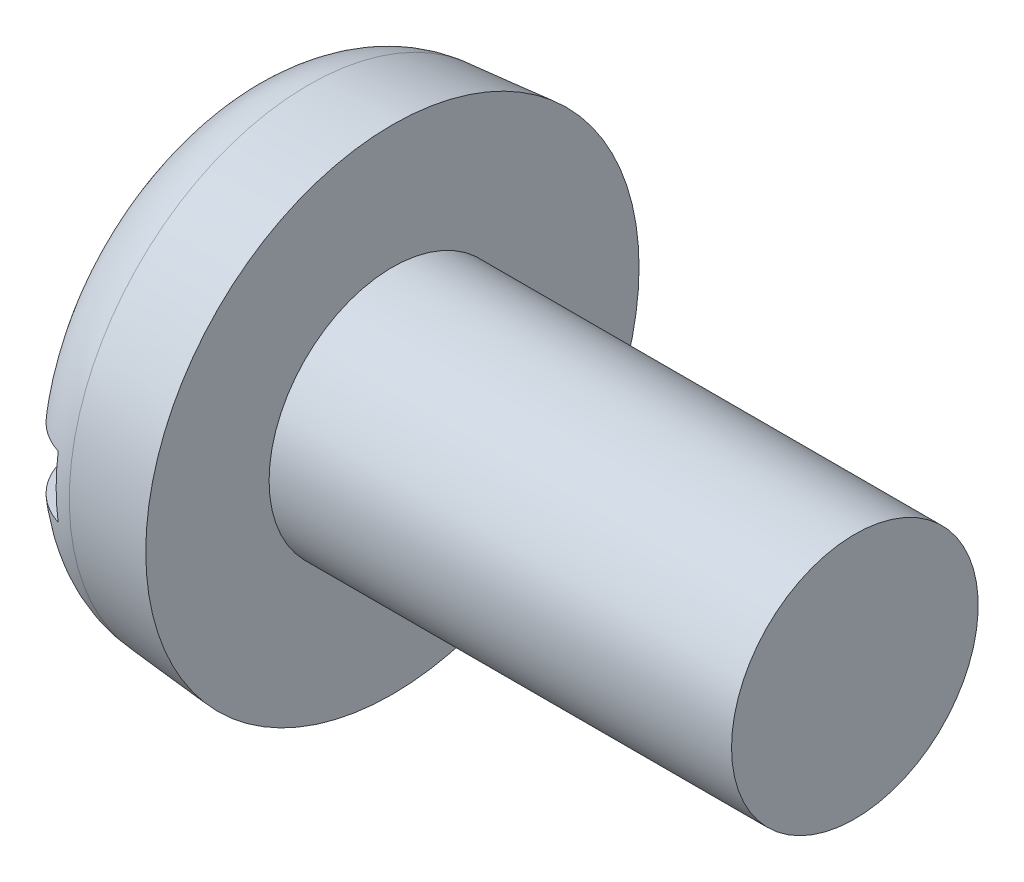
ISO-10303-21;
HEADER;
FILE_DESCRIPTION(('STEP AP214'),'2;1');
FILE_NAME('part.step','',(''),(''),'','','');
FILE_SCHEMA(('AUTOMOTIVE_DESIGN { 1 0 10303 214 1 1 1 1 }'));
ENDSEC;
DATA;
#1=APPLICATION_CONTEXT('core data for automotive mechanical design processes');
#2=APPLICATION_PROTOCOL_DEFINITION('international standard','automotive_design',2000,#1);
#3=PRODUCT_CONTEXT('',#1,'mechanical');
#4=PRODUCT('Part','Part','',(#3));
#5=PRODUCT_RELATED_PRODUCT_CATEGORY('part','',(#4));
#6=PRODUCT_DEFINITION_FORMATION('','',#4);
#7=PRODUCT_DEFINITION_CONTEXT('part definition',#1,'design');
#8=PRODUCT_DEFINITION('design','',#6,#7);
#9=PRODUCT_DEFINITION_SHAPE('','',#8);
#10=(LENGTH_UNIT() NAMED_UNIT(*) SI_UNIT(.MILLI.,.METRE.));
#11=(NAMED_UNIT(*) PLANE_ANGLE_UNIT() SI_UNIT($,.RADIAN.));
#12=(NAMED_UNIT(*) SI_UNIT($,.STERADIAN.) SOLID_ANGLE_UNIT());
#13=UNCERTAINTY_MEASURE_WITH_UNIT(LENGTH_MEASURE(1.E-05),#10,'distance_accuracy_value','');
#14=(GEOMETRIC_REPRESENTATION_CONTEXT(3) GLOBAL_UNCERTAINTY_ASSIGNED_CONTEXT((#13)) GLOBAL_UNIT_ASSIGNED_CONTEXT((#10,
#11,#12)) REPRESENTATION_CONTEXT('',''));
#15=CARTESIAN_POINT('',(0.,0.,0.));
#16=DIRECTION('',(0.,0.,1.));
#17=DIRECTION('',(1.,0.,0.));
#18=AXIS2_PLACEMENT_3D('',#15,#16,#17);
#19=CARTESIAN_POINT('',(0.35,0.2,-1.6));
#20=DIRECTION('',(-1.,0.,0.));
#21=DIRECTION('',(0.,0.,1.));
#22=AXIS2_PLACEMENT_3D('',#19,#20,#21);
#23=PLANE('',#22);
#24=DIRECTION('',(0.,0.,1.));
#25=VECTOR('',#24,1.);
#26=CARTESIAN_POINT('',(0.35,0.2,1.6));
#27=LINE('',#26,#25);
#28=CARTESIAN_POINT('',(0.349999999999835,0.199999999999793,1.51819850536019));
#29=VERTEX_POINT('',#28);
#30=CARTESIAN_POINT('',(0.35,0.2,-1.51819850536023));
#31=VERTEX_POINT('',#30);
#32=EDGE_CURVE('E68',#29,#31,#27,.F.);
#33=ORIENTED_EDGE('',*,*,#32,.T.);
#34=CARTESIAN_POINT('',(0.35,0.,0.));
#35=DIRECTION('',(-1.,0.,0.));
#36=DIRECTION('',(0.,0.,1.));
#37=AXIS2_PLACEMENT_3D('',#34,#35,#36);
#38=CIRCLE('',#37,1.53131535017384);
#39=CARTESIAN_POINT('',(0.349999999999834,-0.199999999999793,-1.51819850536019));
#40=VERTEX_POINT('',#39);
#41=EDGE_CURVE('E69',#31,#40,#38,.T.);
#42=ORIENTED_EDGE('',*,*,#41,.T.);
#43=DIRECTION('',(0.,0.,-1.));
#44=VECTOR('',#43,1.);
#45=CARTESIAN_POINT('',(0.35,-0.2,-1.6));
#46=LINE('',#45,#44);
#47=CARTESIAN_POINT('',(0.35,-0.2,1.51819850536022));
#48=VERTEX_POINT('',#47);
#49=EDGE_CURVE('E74',#40,#48,#46,.F.);
#50=ORIENTED_EDGE('',*,*,#49,.T.);
#51=CARTESIAN_POINT('',(0.35,0.,0.));
#52=DIRECTION('',(-1.,0.,0.));
#53=DIRECTION('',(0.,0.,1.));
#54=AXIS2_PLACEMENT_3D('',#51,#52,#53);
#55=CIRCLE('',#54,1.53131535017384);
#56=EDGE_CURVE('E60',#48,#29,#55,.T.);
#57=ORIENTED_EDGE('',*,*,#56,.T.);
#58=EDGE_LOOP('',(#33,#42,#50,#57));
#59=FACE_BOUND('',#58,.T.);
#60=ADVANCED_FACE('F16',(#59),#23,.T.);
#61=CARTESIAN_POINT('',(0.35,0.2,1.6));
#62=DIRECTION('',(0.,1.,0.));
#63=DIRECTION('',(0.,0.,1.));
#64=AXIS2_PLACEMENT_3D('',#61,#62,#63);
#65=PLANE('',#64);
#66=ORIENTED_EDGE('',*,*,#32,.F.);
#67=CARTESIAN_POINT('',(0.,0.2,1.03520285906468));
#68=CARTESIAN_POINT('',(-2.52565124025773E-05,0.2,1.06398942688886));
#69=CARTESIAN_POINT('',(0.00239534395180603,0.2,1.09277660084004));
#70=CARTESIAN_POINT('',(0.011993694089263,0.199999999999999,1.14954669303311));
#71=CARTESIAN_POINT('',(0.0191714600613404,0.199999999999999,1.17752960851913));
#72=CARTESIAN_POINT('',(0.0381572634266694,0.2,1.23190752879651));
#73=CARTESIAN_POINT('',(0.0499690478429554,0.2,1.25830122859183));
#74=CARTESIAN_POINT('',(0.0779019805481425,0.199999999999999,1.30868833290163));
#75=CARTESIAN_POINT('',(0.0940213396990673,0.199999999999998,1.33268272828687));
#76=CARTESIAN_POINT('',(0.129920365551768,0.200000000000001,1.37730869344704));
#77=CARTESIAN_POINT('',(0.149656782487622,0.200000000000004,1.39797508011017));
#78=CARTESIAN_POINT('',(0.192357837863388,0.199999999999995,1.43565403545429));
#79=CARTESIAN_POINT('',(0.215321683893188,0.199999999999982,1.45266749843034));
#80=CARTESIAN_POINT('',(0.256853305411126,0.200000000000012,1.47824645999629));
#81=CARTESIAN_POINT('',(0.274799358160407,0.20000000000004,1.48783634789716));
#82=CARTESIAN_POINT('',(0.311701903339497,0.199999999999959,1.50474541878339));
#83=CARTESIAN_POINT('',(0.330657018346502,0.199999999999849,1.51206760864745));
#84=CARTESIAN_POINT('',(0.349999999999669,0.199999999999586,1.51819850536015));
#85=B_SPLINE_CURVE_WITH_KNOTS('',3,(#67,#68,#69,#70,#71,#72,#73,#74,#75,#76,#77,#78,#79,#80,#81,
#82,#83,#84),.UNSPECIFIED.,.F.,.F.,(4,2,2,2,2,2,2,2,4),(0.,0.0862592942144168,0.172518883968848,
0.258848366636405,0.345142048198988,0.430464256630041,0.515765552920492,0.576664353163027,
0.63748205480109),.UNSPECIFIED.);
#86=CARTESIAN_POINT('',(0.,0.2,1.03520285906468));
#87=VERTEX_POINT('',#86);
#88=EDGE_CURVE('E57',#87,#29,#85,.T.);
#89=ORIENTED_EDGE('',*,*,#88,.F.);
#90=DIRECTION('',(0.,0.,1.));
#91=VECTOR('',#90,1.);
#92=CARTESIAN_POINT('',(0.,0.2,0.));
#93=LINE('',#92,#91);
#94=CARTESIAN_POINT('',(0.,0.199999999999999,-1.03520285906468));
#95=VERTEX_POINT('',#94);
#96=EDGE_CURVE('E91',#95,#87,#93,.T.);
#97=ORIENTED_EDGE('',*,*,#96,.F.);
#98=CARTESIAN_POINT('',(0.35,0.199999999999999,-1.51819850536023));
#99=CARTESIAN_POINT('',(0.323240170434946,0.2,-1.50973611360305));
#100=CARTESIAN_POINT('',(0.297223399151958,0.2,-1.49896341671616));
#101=CARTESIAN_POINT('',(0.247382863387567,0.2,-1.47322280717213));
#102=CARTESIAN_POINT('',(0.22355717601464,0.199999999999999,-1.45825862054231));
#103=CARTESIAN_POINT('',(0.178749771716697,0.199999999999999,-1.4245393857271));
#104=CARTESIAN_POINT('',(0.157768828003571,0.2,-1.40578331032929));
#105=CARTESIAN_POINT('',(0.119235913864786,0.2,-1.36503775180001));
#106=CARTESIAN_POINT('',(0.101683299381427,0.199999999999999,-1.34304887735634));
#107=CARTESIAN_POINT('',(0.0703839506758041,0.199999999999999,-1.29633196559335));
#108=CARTESIAN_POINT('',(0.0566594493260357,0.2,-1.2715890486793));
#109=CARTESIAN_POINT('',(0.0335020201108158,0.2,-1.22016321329946));
#110=CARTESIAN_POINT('',(0.0240695310400297,0.2,-1.19348009680028));
#111=CARTESIAN_POINT('',(0.0112790664490366,0.2,-1.14484332835447));
#112=CARTESIAN_POINT('',(0.00704876642651118,0.2,-1.12311410085165));
#113=CARTESIAN_POINT('',(0.00140802178224289,0.2,-1.07932567669856));
#114=CARTESIAN_POINT('',(-6.64778774481011E-06,0.199999999999999,-1.05726702455209));
#115=CARTESIAN_POINT('',(0.,0.199999999999999,-1.03520285906468));
#116=B_SPLINE_CURVE_WITH_KNOTS('',3,(#98,#99,#100,#101,#102,#103,#104,#105,#106,#107,#108,#109,
#110,#111,#112,#113,#114,#115),.UNSPECIFIED.,.F.,.F.,(4,2,2,2,2,2,2,2,4),(0.,0.0840811674026416,
0.168087826728181,0.252117273797876,0.336130919591389,0.420622794490028,0.505123305491316,
0.571358521276608,0.637494273734758),.UNSPECIFIED.);
#117=EDGE_CURVE('E78',#31,#95,#116,.T.);
#118=ORIENTED_EDGE('',*,*,#117,.F.);
#119=EDGE_LOOP('',(#66,#89,#97,#118));
#120=FACE_BOUND('',#119,.T.);
#121=ADVANCED_FACE('F77',(#120),#65,.F.);
#122=CARTESIAN_POINT('',(0.35,-0.2,-1.6));
#123=DIRECTION('',(0.,-1.,0.));
#124=DIRECTION('',(0.,0.,-1.));
#125=AXIS2_PLACEMENT_3D('',#122,#123,#124);
#126=PLANE('',#125);
#127=DIRECTION('',(0.,0.,1.));
#128=VECTOR('',#127,1.);
#129=CARTESIAN_POINT('',(0.,-0.2,0.));
#130=LINE('',#129,#128);
#131=CARTESIAN_POINT('',(0.,-0.2,1.03520285906468));
#132=VERTEX_POINT('',#131);
#133=CARTESIAN_POINT('',(0.,-0.2,-1.03520285906468));
#134=VERTEX_POINT('',#133);
#135=EDGE_CURVE('E129',#132,#134,#130,.F.);
#136=ORIENTED_EDGE('',*,*,#135,.F.);
#137=CARTESIAN_POINT('',(0.35,-0.200000000000001,1.51819850536022));
#138=CARTESIAN_POINT('',(0.323240170434946,-0.200000000000001,1.50973611360305));
#139=CARTESIAN_POINT('',(0.297223399151958,-0.2,1.49896341671616));
#140=CARTESIAN_POINT('',(0.247382863387567,-0.2,1.47322280717213));
#141=CARTESIAN_POINT('',(0.223557176014639,-0.2,1.45825862054231));
#142=CARTESIAN_POINT('',(0.178749771716697,-0.2,1.4245393857271));
#143=CARTESIAN_POINT('',(0.157768828003571,-0.2,1.40578331032929));
#144=CARTESIAN_POINT('',(0.119235913864785,-0.2,1.36503775180001));
#145=CARTESIAN_POINT('',(0.101683299381426,-0.2,1.34304887735634));
#146=CARTESIAN_POINT('',(0.0703839506758038,-0.2,1.29633196559335));
#147=CARTESIAN_POINT('',(0.0566594493260355,-0.2,1.2715890486793));
#148=CARTESIAN_POINT('',(0.0335020201108157,-0.2,1.22016321329946));
#149=CARTESIAN_POINT('',(0.0240695310400296,-0.2,1.19348009680028));
#150=CARTESIAN_POINT('',(0.0112790664490365,-0.2,1.14484332835447));
#151=CARTESIAN_POINT('',(0.00704876642651107,-0.2,1.12311410085165));
#152=CARTESIAN_POINT('',(0.0014080217822428,-0.2,1.07932567669856));
#153=CARTESIAN_POINT('',(-6.64778774487383E-06,-0.2,1.05726702455209));
#154=CARTESIAN_POINT('',(0.,-0.200000000000001,1.03520285906468));
#155=B_SPLINE_CURVE_WITH_KNOTS('',3,(#137,#138,#139,#140,#141,#142,#143,#144,#145,#146,#147,
#148,#149,#150,#151,#152,#153,#154),.UNSPECIFIED.,.F.,.F.,(4,2,2,2,2,2,2,2,4),(0.,
0.0840811674026413,0.16808782672818,0.252117273797876,0.336130919591389,0.420622794490028,
0.505123305491316,0.571358521276608,0.637494273734758),.UNSPECIFIED.);
#156=EDGE_CURVE('E92',#48,#132,#155,.T.);
#157=ORIENTED_EDGE('',*,*,#156,.F.);
#158=ORIENTED_EDGE('',*,*,#49,.F.);
#159=CARTESIAN_POINT('',(0.,-0.199999999999999,-1.03520285906468));
#160=CARTESIAN_POINT('',(-2.52565124025997E-05,-0.199999999999999,-1.06398942688886));
#161=CARTESIAN_POINT('',(0.00239534395180602,-0.2,-1.09277660084004));
#162=CARTESIAN_POINT('',(0.011993694089263,-0.2,-1.14954669303311));
#163=CARTESIAN_POINT('',(0.0191714600613405,-0.2,-1.17752960851913));
#164=CARTESIAN_POINT('',(0.0381572634266693,-0.2,-1.23190752879651));
#165=CARTESIAN_POINT('',(0.0499690478429553,-0.2,-1.25830122859183));
#166=CARTESIAN_POINT('',(0.0779019805481424,-0.199999999999999,-1.30868833290163));
#167=CARTESIAN_POINT('',(0.0940213396990673,-0.199999999999999,-1.33268272828687));
#168=CARTESIAN_POINT('',(0.129920365551768,-0.200000000000001,-1.37730869344704));
#169=CARTESIAN_POINT('',(0.149656782487622,-0.200000000000004,-1.39797508011017));
#170=CARTESIAN_POINT('',(0.192357837863388,-0.199999999999995,-1.43565403545429));
#171=CARTESIAN_POINT('',(0.215321683893188,-0.199999999999983,-1.45266749843034));
#172=CARTESIAN_POINT('',(0.256853305411126,-0.200000000000013,-1.47824645999629));
#173=CARTESIAN_POINT('',(0.274799358160407,-0.200000000000041,-1.48783634789716));
#174=CARTESIAN_POINT('',(0.311701903339496,-0.199999999999959,-1.50474541878339));
#175=CARTESIAN_POINT('',(0.330657018346502,-0.199999999999849,-1.51206760864745));
#176=CARTESIAN_POINT('',(0.349999999999669,-0.199999999999587,-1.51819850536015));
#177=B_SPLINE_CURVE_WITH_KNOTS('',3,(#159,#160,#161,#162,#163,#164,#165,#166,#167,#168,#169,
#170,#171,#172,#173,#174,#175,#176),.UNSPECIFIED.,.F.,.F.,(4,2,2,2,2,2,2,2,4),(0.,
0.086259294214417,0.172518883968848,0.258848366636405,0.345142048198988,0.430464256630042,
0.515765552920492,0.576664353163027,0.637482054801089),.UNSPECIFIED.);
#178=EDGE_CURVE('E36',#134,#40,#177,.T.);
#179=ORIENTED_EDGE('',*,*,#178,.F.);
#180=EDGE_LOOP('',(#136,#157,#158,#179));
#181=FACE_BOUND('',#180,.T.);
#182=ADVANCED_FACE('F100',(#181),#126,.F.);
#183=CARTESIAN_POINT('',(0.,0.,0.));
#184=DIRECTION('',(-1.,0.,0.));
#185=DIRECTION('',(0.,0.,1.));
#186=AXIS2_PLACEMENT_3D('',#183,#184,#185);
#187=PLANE('',#186);
#188=ORIENTED_EDGE('',*,*,#96,.T.);
#189=CARTESIAN_POINT('',(0.,0.,0.));
#190=DIRECTION('',(1.,0.,0.));
#191=DIRECTION('',(0.,0.189691095261128,-0.981843820767149));
#192=AXIS2_PLACEMENT_3D('',#189,#190,#191);
#193=CIRCLE('',#192,1.05434574946536);
#194=EDGE_CURVE('E63',#95,#87,#193,.T.);
#195=ORIENTED_EDGE('',*,*,#194,.F.);
#196=EDGE_LOOP('',(#188,#195));
#197=FACE_BOUND('',#196,.T.);
#198=ADVANCED_FACE('F138',(#197),#187,.T.);
#199=CARTESIAN_POINT('',(0.,0.,0.));
#200=DIRECTION('',(-1.,0.,0.));
#201=DIRECTION('',(0.,0.,1.));
#202=AXIS2_PLACEMENT_3D('',#199,#200,#201);
#203=PLANE('',#202);
#204=ORIENTED_EDGE('',*,*,#135,.T.);
#205=CARTESIAN_POINT('',(0.,0.,0.));
#206=DIRECTION('',(1.,0.,0.));
#207=DIRECTION('',(0.,-0.189691095261129,0.981843820767149));
#208=AXIS2_PLACEMENT_3D('',#205,#206,#207);
#209=CIRCLE('',#208,1.05434574946536);
#210=EDGE_CURVE('E125',#132,#134,#209,.T.);
#211=ORIENTED_EDGE('',*,*,#210,.F.);
#212=EDGE_LOOP('',(#204,#211));
#213=FACE_BOUND('',#212,.T.);
#214=ADVANCED_FACE('F109',(#213),#203,.T.);
#215=CARTESIAN_POINT('',(0.5,0.,0.));
#216=DIRECTION('',(-1.,0.,0.));
#217=DIRECTION('',(0.,0.,1.));
#218=AXIS2_PLACEMENT_3D('',#215,#216,#217);
#219=TOROIDAL_SURFACE('',#218,1.05434574946536,0.5);
#220=CARTESIAN_POINT('',(0.456422128650047,0.,0.));
#221=DIRECTION('',(1.,0.,0.));
#222=DIRECTION('',(0.,0.,-1.));
#223=AXIS2_PLACEMENT_3D('',#220,#221,#222);
#224=CIRCLE('',#223,1.55244309851099);
#225=CARTESIAN_POINT('',(0.456422128650047,0.,-1.55244309851099));
#226=VERTEX_POINT('',#225);
#227=EDGE_CURVE('E89',#226,#226,#224,.T.);
#228=ORIENTED_EDGE('',*,*,#227,.F.);
#229=EDGE_LOOP('',(#228));
#230=FACE_BOUND('',#229,.T.);
#231=ORIENTED_EDGE('',*,*,#178,.T.);
#232=ORIENTED_EDGE('',*,*,#41,.F.);
#233=ORIENTED_EDGE('',*,*,#117,.T.);
#234=ORIENTED_EDGE('',*,*,#194,.T.);
#235=ORIENTED_EDGE('',*,*,#88,.T.);
#236=ORIENTED_EDGE('',*,*,#56,.F.);
#237=ORIENTED_EDGE('',*,*,#156,.T.);
#238=ORIENTED_EDGE('',*,*,#210,.T.);
#239=EDGE_LOOP('',(#231,#232,#233,#234,#235,#236,#237,#238));
#240=FACE_BOUND('',#239,.T.);
#241=ADVANCED_FACE('F59',(#230,#240),#219,.T.);
#242=CARTESIAN_POINT('',(0.999999999862666,0.,0.));
#243=DIRECTION('',(1.,0.,0.));
#244=DIRECTION('',(0.,0.,-1.));
#245=AXIS2_PLACEMENT_3D('',#242,#243,#244);
#246=CONICAL_SURFACE('',#245,1.59999999998917,0.0872664626139198);
#247=ORIENTED_EDGE('',*,*,#227,.T.);
#248=EDGE_LOOP('',(#247));
#249=FACE_BOUND('',#248,.T.);
#250=CARTESIAN_POINT('',(0.999999999976353,0.,0.));
#251=DIRECTION('',(1.,0.,0.));
#252=DIRECTION('',(0.,0.,-1.));
#253=AXIS2_PLACEMENT_3D('',#250,#251,#252);
#254=CIRCLE('',#253,1.59999999999911);
#255=CARTESIAN_POINT('',(0.999999999976353,0.,-1.59999999999911));
#256=VERTEX_POINT('',#255);
#257=EDGE_CURVE('E86',#256,#256,#254,.F.);
#258=ORIENTED_EDGE('',*,*,#257,.T.);
#259=EDGE_LOOP('',(#258));
#260=FACE_BOUND('',#259,.T.);
#261=ADVANCED_FACE('F108',(#249,#260),#246,.T.);
#262=CARTESIAN_POINT('',(4.,0.8,0.));
#263=DIRECTION('',(1.,0.,0.));
#264=DIRECTION('',(0.,0.,-1.));
#265=AXIS2_PLACEMENT_3D('',#262,#263,#264);
#266=PLANE('',#265);
#267=CARTESIAN_POINT('',(4.,0.,0.));
#268=DIRECTION('',(-1.,0.,0.));
#269=DIRECTION('',(0.,0.,1.));
#270=AXIS2_PLACEMENT_3D('',#267,#268,#269);
#271=CIRCLE('',#270,0.8);
#272=CARTESIAN_POINT('',(4.,0.,0.8));
#273=VERTEX_POINT('',#272);
#274=EDGE_CURVE('E27',#273,#273,#271,.T.);
#275=ORIENTED_EDGE('',*,*,#274,.F.);
#276=EDGE_LOOP('',(#275));
#277=FACE_BOUND('',#276,.T.);
#278=ADVANCED_FACE('F160',(#277),#266,.T.);
#279=CARTESIAN_POINT('',(1.,0.8,0.));
#280=DIRECTION('',(-1.,0.,0.));
#281=DIRECTION('',(0.,0.,1.));
#282=AXIS2_PLACEMENT_3D('',#279,#280,#281);
#283=PLANE('',#282);
#284=CARTESIAN_POINT('',(1.,0.,0.));
#285=DIRECTION('',(-1.,0.,0.));
#286=DIRECTION('',(0.,0.,1.));
#287=AXIS2_PLACEMENT_3D('',#284,#285,#286);
#288=CIRCLE('',#287,0.8);
#289=CARTESIAN_POINT('',(1.,0.,0.8));
#290=VERTEX_POINT('',#289);
#291=EDGE_CURVE('E11',#290,#290,#288,.F.);
#292=ORIENTED_EDGE('',*,*,#291,.F.);
#293=EDGE_LOOP('',(#292));
#294=FACE_BOUND('',#293,.T.);
#295=ORIENTED_EDGE('',*,*,#257,.F.);
#296=EDGE_LOOP('',(#295));
#297=FACE_BOUND('',#296,.T.);
#298=ADVANCED_FACE('F163',(#294,#297),#283,.F.);
#299=CARTESIAN_POINT('',(-25.4,0.,0.));
#300=DIRECTION('',(-1.,0.,0.));
#301=DIRECTION('',(0.,0.,1.));
#302=AXIS2_PLACEMENT_3D('',#299,#300,#301);
#303=CYLINDRICAL_SURFACE('',#302,0.8);
#304=ORIENTED_EDGE('',*,*,#291,.T.);
#305=EDGE_LOOP('',(#304));
#306=FACE_BOUND('',#305,.T.);
#307=ORIENTED_EDGE('',*,*,#274,.T.);
#308=EDGE_LOOP('',(#307));
#309=FACE_BOUND('',#308,.T.);
#310=ADVANCED_FACE('F165',(#306,#309),#303,.T.);
#311=CLOSED_SHELL('',(#60,#121,#182,#198,#214,#241,#261,#278,#298,#310));
#312=MANIFOLD_SOLID_BREP('B1',#311);
#313=ADVANCED_BREP_SHAPE_REPRESENTATION('',(#18,#312),#14);
#314=SHAPE_DEFINITION_REPRESENTATION(#9,#313);
ENDSEC;
END-ISO-10303-21;
